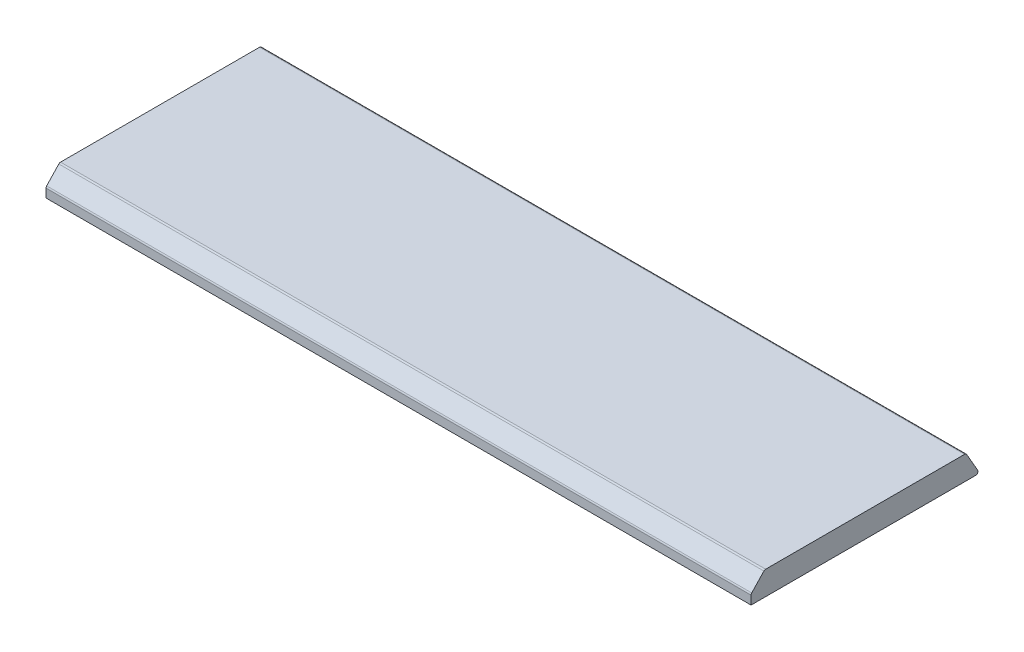
ISO-10303-21;
HEADER;
FILE_DESCRIPTION(('STEP AP214'),'2;1');
FILE_NAME('part.step','',(''),(''),'','','');
FILE_SCHEMA(('AUTOMOTIVE_DESIGN { 1 0 10303 214 1 1 1 1 }'));
ENDSEC;
DATA;
#1=APPLICATION_CONTEXT('core data for automotive mechanical design processes');
#2=APPLICATION_PROTOCOL_DEFINITION('international standard','automotive_design',2000,#1);
#3=PRODUCT_CONTEXT('',#1,'mechanical');
#4=PRODUCT('Part','Part','',(#3));
#5=PRODUCT_RELATED_PRODUCT_CATEGORY('part','',(#4));
#6=PRODUCT_DEFINITION_FORMATION('','',#4);
#7=PRODUCT_DEFINITION_CONTEXT('part definition',#1,'design');
#8=PRODUCT_DEFINITION('design','',#6,#7);
#9=PRODUCT_DEFINITION_SHAPE('','',#8);
#10=(LENGTH_UNIT() NAMED_UNIT(*) SI_UNIT(.MILLI.,.METRE.));
#11=(NAMED_UNIT(*) PLANE_ANGLE_UNIT() SI_UNIT($,.RADIAN.));
#12=(NAMED_UNIT(*) SI_UNIT($,.STERADIAN.) SOLID_ANGLE_UNIT());
#13=UNCERTAINTY_MEASURE_WITH_UNIT(LENGTH_MEASURE(1.E-05),#10,'distance_accuracy_value','');
#14=(GEOMETRIC_REPRESENTATION_CONTEXT(3) GLOBAL_UNCERTAINTY_ASSIGNED_CONTEXT((#13)) GLOBAL_UNIT_ASSIGNED_CONTEXT((#10,
#11,#12)) REPRESENTATION_CONTEXT('',''));
#15=CARTESIAN_POINT('',(0.,0.,0.));
#16=DIRECTION('',(0.,0.,1.));
#17=DIRECTION('',(1.,0.,0.));
#18=AXIS2_PLACEMENT_3D('',#15,#16,#17);
#19=CARTESIAN_POINT('',(-234.95,3.17499999999993,0.));
#20=DIRECTION('',(0.,0.,1.));
#21=DIRECTION('',(0.,-1.,0.));
#22=AXIS2_PLACEMENT_3D('',#19,#20,#21);
#23=PLANE('',#22);
#24=DIRECTION('',(0.,-1.,0.));
#25=VECTOR('',#24,1.);
#26=CARTESIAN_POINT('',(0.,3.17499999999993,0.));
#27=LINE('',#26,#25);
#28=CARTESIAN_POINT('',(0.,2.85900833816846,0.));
#29=VERTEX_POINT('',#28);
#30=CARTESIAN_POINT('',(0.,0.,0.));
#31=VERTEX_POINT('',#30);
#32=EDGE_CURVE('E146',#29,#31,#27,.T.);
#33=ORIENTED_EDGE('',*,*,#32,.F.);
#34=DIRECTION('',(1.,0.,0.));
#35=VECTOR('',#34,1.);
#36=CARTESIAN_POINT('',(-234.95,2.85900833816846,0.));
#37=LINE('',#36,#35);
#38=CARTESIAN_POINT('',(-234.95,2.85900833816846,0.));
#39=VERTEX_POINT('',#38);
#40=EDGE_CURVE('E11',#29,#39,#37,.F.);
#41=ORIENTED_EDGE('',*,*,#40,.T.);
#42=DIRECTION('',(0.,-1.,0.));
#43=VECTOR('',#42,1.);
#44=CARTESIAN_POINT('',(-234.95,3.17499999999993,0.));
#45=LINE('',#44,#43);
#46=CARTESIAN_POINT('',(-234.95,0.,0.));
#47=VERTEX_POINT('',#46);
#48=EDGE_CURVE('E116',#39,#47,#45,.T.);
#49=ORIENTED_EDGE('',*,*,#48,.T.);
#50=DIRECTION('',(1.,0.,0.));
#51=VECTOR('',#50,1.);
#52=CARTESIAN_POINT('',(-234.95,0.,0.));
#53=LINE('',#52,#51);
#54=EDGE_CURVE('E119',#47,#31,#53,.T.);
#55=ORIENTED_EDGE('',*,*,#54,.T.);
#56=EDGE_LOOP('',(#33,#41,#49,#55));
#57=FACE_BOUND('',#56,.T.);
#58=ADVANCED_FACE('F43',(#57),#23,.T.);
#59=CARTESIAN_POINT('',(-234.95,7.93749999999999,-4.50603104530065));
#60=DIRECTION('',(0.,0.687277405539241,0.7263950494292));
#61=DIRECTION('',(0.,-0.7263950494292,0.687277405539241));
#62=AXIS2_PLACEMENT_3D('',#59,#60,#61);
#63=PLANE('',#62);
#64=DIRECTION('',(0.,-0.7263950494292,0.687277405539241));
#65=VECTOR('',#64,1.);
#66=CARTESIAN_POINT('',(-234.95,7.93749999999999,-4.50603104530065));
#67=LINE('',#66,#65);
#68=CARTESIAN_POINT('',(-234.95,7.68927644064676,-4.27117475876612));
#69=VERTEX_POINT('',#68);
#70=CARTESIAN_POINT('',(-234.95,3.40453477881523,-0.217173929515574));
#71=VERTEX_POINT('',#70);
#72=EDGE_CURVE('E133',#69,#71,#67,.T.);
#73=ORIENTED_EDGE('',*,*,#72,.T.);
#74=DIRECTION('',(1.,0.,0.));
#75=VECTOR('',#74,1.);
#76=CARTESIAN_POINT('',(-234.95,3.40453477881523,-0.217173929515574));
#77=LINE('',#76,#75);
#78=CARTESIAN_POINT('',(0.,3.40453477881523,-0.217173929515574));
#79=VERTEX_POINT('',#78);
#80=EDGE_CURVE('E52',#71,#79,#77,.T.);
#81=ORIENTED_EDGE('',*,*,#80,.T.);
#82=DIRECTION('',(0.,-0.7263950494292,0.687277405539241));
#83=VECTOR('',#82,1.);
#84=CARTESIAN_POINT('',(0.,7.93749999999999,-4.50603104530065));
#85=LINE('',#84,#83);
#86=CARTESIAN_POINT('',(0.,7.68927644064676,-4.27117475876612));
#87=VERTEX_POINT('',#86);
#88=EDGE_CURVE('E123',#87,#79,#85,.T.);
#89=ORIENTED_EDGE('',*,*,#88,.F.);
#90=DIRECTION('',(1.,0.,0.));
#91=VECTOR('',#90,1.);
#92=CARTESIAN_POINT('',(-234.95,7.68927644064676,-4.27117475876612));
#93=LINE('',#92,#91);
#94=EDGE_CURVE('E189',#87,#69,#93,.F.);
#95=ORIENTED_EDGE('',*,*,#94,.T.);
#96=EDGE_LOOP('',(#73,#81,#89,#95));
#97=FACE_BOUND('',#96,.T.);
#98=ADVANCED_FACE('F196',(#97),#63,.T.);
#99=CARTESIAN_POINT('',(-234.95,7.9375,-71.6172822383074));
#100=DIRECTION('',(0.,1.,0.));
#101=DIRECTION('',(0.,0.,1.));
#102=AXIS2_PLACEMENT_3D('',#99,#100,#101);
#103=PLANE('',#102);
#104=DIRECTION('',(0.,0.,1.));
#105=VECTOR('',#104,1.);
#106=CARTESIAN_POINT('',(0.,7.9375,-71.6172822383074));
#107=LINE('',#106,#105);
#108=CARTESIAN_POINT('',(0.,7.9375,-71.1590104621381));
#109=VERTEX_POINT('',#108);
#110=CARTESIAN_POINT('',(0.,7.93749999999999,-4.84775082925054));
#111=VERTEX_POINT('',#110);
#112=EDGE_CURVE('E153',#109,#111,#107,.T.);
#113=ORIENTED_EDGE('',*,*,#112,.F.);
#114=DIRECTION('',(1.,0.,0.));
#115=VECTOR('',#114,1.);
#116=CARTESIAN_POINT('',(-234.95,7.9375,-71.1590104621381));
#117=LINE('',#116,#115);
#118=CARTESIAN_POINT('',(-234.95,7.9375,-71.1590104621381));
#119=VERTEX_POINT('',#118);
#120=EDGE_CURVE('E177',#109,#119,#117,.F.);
#121=ORIENTED_EDGE('',*,*,#120,.T.);
#122=DIRECTION('',(0.,0.,1.));
#123=VECTOR('',#122,1.);
#124=CARTESIAN_POINT('',(-234.95,7.9375,-71.6172822383074));
#125=LINE('',#124,#123);
#126=CARTESIAN_POINT('',(-234.95,7.93749999999999,-4.84775082925054));
#127=VERTEX_POINT('',#126);
#128=EDGE_CURVE('E140',#119,#127,#125,.T.);
#129=ORIENTED_EDGE('',*,*,#128,.T.);
#130=DIRECTION('',(1.,0.,0.));
#131=VECTOR('',#130,1.);
#132=CARTESIAN_POINT('',(-234.95,7.93749999999999,-4.84775082925054));
#133=LINE('',#132,#131);
#134=EDGE_CURVE('E173',#127,#111,#133,.T.);
#135=ORIENTED_EDGE('',*,*,#134,.T.);
#136=EDGE_LOOP('',(#113,#121,#129,#135));
#137=FACE_BOUND('',#136,.T.);
#138=ADVANCED_FACE('F206',(#137),#103,.T.);
#139=CARTESIAN_POINT('',(-234.95,0.,-76.2));
#140=DIRECTION('',(0.,0.5,-0.866025403784439));
#141=DIRECTION('',(0.,0.866025403784439,0.5));
#142=AXIS2_PLACEMENT_3D('',#139,#140,#141);
#143=PLANE('',#142);
#144=DIRECTION('',(0.,0.866025403784439,0.5));
#145=VECTOR('',#144,1.);
#146=CARTESIAN_POINT('',(-234.95,0.,-76.2));
#147=LINE('',#146,#145);
#148=CARTESIAN_POINT('',(-234.95,1.19062500000001,-75.5125923357461));
#149=VERTEX_POINT('',#148);
#150=CARTESIAN_POINT('',(-234.95,7.54062499999999,-71.846418126392));
#151=VERTEX_POINT('',#150);
#152=EDGE_CURVE('E137',#149,#151,#147,.T.);
#153=ORIENTED_EDGE('',*,*,#152,.T.);
#154=DIRECTION('',(1.,0.,0.));
#155=VECTOR('',#154,1.);
#156=CARTESIAN_POINT('',(-234.95,7.540625,-71.846418126392));
#157=LINE('',#156,#155);
#158=CARTESIAN_POINT('',(0.,7.54062499999999,-71.846418126392));
#159=VERTEX_POINT('',#158);
#160=EDGE_CURVE('E161',#151,#159,#157,.T.);
#161=ORIENTED_EDGE('',*,*,#160,.T.);
#162=DIRECTION('',(0.,0.866025403784439,0.5));
#163=VECTOR('',#162,1.);
#164=CARTESIAN_POINT('',(0.,0.,-76.2));
#165=LINE('',#164,#163);
#166=CARTESIAN_POINT('',(0.,1.19062500000001,-75.5125923357461));
#167=VERTEX_POINT('',#166);
#168=EDGE_CURVE('E150',#167,#159,#165,.T.);
#169=ORIENTED_EDGE('',*,*,#168,.F.);
#170=DIRECTION('',(1.,0.,0.));
#171=VECTOR('',#170,1.);
#172=CARTESIAN_POINT('',(-234.95,1.19062500000001,-75.5125923357461));
#173=LINE('',#172,#171);
#174=EDGE_CURVE('E132',#167,#149,#173,.F.);
#175=ORIENTED_EDGE('',*,*,#174,.T.);
#176=EDGE_LOOP('',(#153,#161,#169,#175));
#177=FACE_BOUND('',#176,.T.);
#178=ADVANCED_FACE('F214',(#177),#143,.T.);
#179=CARTESIAN_POINT('',(-234.95,0.,0.));
#180=DIRECTION('',(0.,-1.,0.));
#181=DIRECTION('',(0.,0.,-1.));
#182=AXIS2_PLACEMENT_3D('',#179,#180,#181);
#183=PLANE('',#182);
#184=DIRECTION('',(0.,0.,-1.));
#185=VECTOR('',#184,1.);
#186=CARTESIAN_POINT('',(-234.95,0.,0.));
#187=LINE('',#186,#185);
#188=CARTESIAN_POINT('',(-234.95,0.,-74.8251846714922));
#189=VERTEX_POINT('',#188);
#190=EDGE_CURVE('E122',#47,#189,#187,.T.);
#191=ORIENTED_EDGE('',*,*,#190,.T.);
#192=DIRECTION('',(1.,0.,0.));
#193=VECTOR('',#192,1.);
#194=CARTESIAN_POINT('',(-234.95,0.,-74.8251846714922));
#195=LINE('',#194,#193);
#196=CARTESIAN_POINT('',(0.,0.,-74.8251846714922));
#197=VERTEX_POINT('',#196);
#198=EDGE_CURVE('E186',#189,#197,#195,.T.);
#199=ORIENTED_EDGE('',*,*,#198,.T.);
#200=DIRECTION('',(0.,0.,-1.));
#201=VECTOR('',#200,1.);
#202=CARTESIAN_POINT('',(0.,0.,0.));
#203=LINE('',#202,#201);
#204=EDGE_CURVE('E130',#31,#197,#203,.T.);
#205=ORIENTED_EDGE('',*,*,#204,.F.);
#206=ORIENTED_EDGE('',*,*,#54,.F.);
#207=EDGE_LOOP('',(#191,#199,#205,#206));
#208=FACE_BOUND('',#207,.T.);
#209=ADVANCED_FACE('F126',(#208),#183,.T.);
#210=CARTESIAN_POINT('',(-234.95,0.,0.));
#211=DIRECTION('',(1.,0.,0.));
#212=DIRECTION('',(0.,0.,-1.));
#213=AXIS2_PLACEMENT_3D('',#210,#211,#212);
#214=PLANE('',#213);
#215=ORIENTED_EDGE('',*,*,#128,.F.);
#216=CARTESIAN_POINT('',(-234.95,7.14375,-71.1590104621381));
#217=DIRECTION('',(1.,0.,0.));
#218=DIRECTION('',(0.,0.,-1.));
#219=AXIS2_PLACEMENT_3D('',#216,#217,#218);
#220=CIRCLE('',#219,0.79375);
#221=EDGE_CURVE('E184',#119,#151,#220,.F.);
#222=ORIENTED_EDGE('',*,*,#221,.T.);
#223=ORIENTED_EDGE('',*,*,#152,.F.);
#224=CARTESIAN_POINT('',(-234.95,0.79375,-74.8251846714922));
#225=DIRECTION('',(1.,0.,0.));
#226=DIRECTION('',(0.,0.,-1.));
#227=AXIS2_PLACEMENT_3D('',#224,#225,#226);
#228=CIRCLE('',#227,0.79375);
#229=EDGE_CURVE('E59',#149,#189,#228,.F.);
#230=ORIENTED_EDGE('',*,*,#229,.T.);
#231=ORIENTED_EDGE('',*,*,#190,.F.);
#232=ORIENTED_EDGE('',*,*,#48,.F.);
#233=CARTESIAN_POINT('',(-234.95,2.85900833816846,-0.79375));
#234=DIRECTION('',(1.,0.,0.));
#235=DIRECTION('',(0.,0.,-1.));
#236=AXIS2_PLACEMENT_3D('',#233,#234,#235);
#237=CIRCLE('',#236,0.79375);
#238=EDGE_CURVE('E66',#39,#71,#237,.F.);
#239=ORIENTED_EDGE('',*,*,#238,.T.);
#240=ORIENTED_EDGE('',*,*,#72,.F.);
#241=CARTESIAN_POINT('',(-234.95,7.14374999999999,-4.84775082925054));
#242=DIRECTION('',(1.,0.,0.));
#243=DIRECTION('',(0.,0.,-1.));
#244=AXIS2_PLACEMENT_3D('',#241,#242,#243);
#245=CIRCLE('',#244,0.79375);
#246=EDGE_CURVE('E180',#69,#127,#245,.F.);
#247=ORIENTED_EDGE('',*,*,#246,.T.);
#248=EDGE_LOOP('',(#215,#222,#223,#230,#231,#232,#239,#240,#247));
#249=FACE_BOUND('',#248,.T.);
#250=ADVANCED_FACE('F136',(#249),#214,.F.);
#251=CARTESIAN_POINT('',(0.,0.,0.));
#252=DIRECTION('',(1.,0.,0.));
#253=DIRECTION('',(0.,0.,-1.));
#254=AXIS2_PLACEMENT_3D('',#251,#252,#253);
#255=PLANE('',#254);
#256=ORIENTED_EDGE('',*,*,#168,.T.);
#257=CARTESIAN_POINT('',(0.,7.14375,-71.1590104621381));
#258=DIRECTION('',(1.,0.,0.));
#259=DIRECTION('',(0.,0.,-1.));
#260=AXIS2_PLACEMENT_3D('',#257,#258,#259);
#261=CIRCLE('',#260,0.79375);
#262=EDGE_CURVE('E171',#159,#109,#261,.T.);
#263=ORIENTED_EDGE('',*,*,#262,.T.);
#264=ORIENTED_EDGE('',*,*,#112,.T.);
#265=CARTESIAN_POINT('',(0.,7.14374999999999,-4.84775082925054));
#266=DIRECTION('',(1.,0.,0.));
#267=DIRECTION('',(0.,0.,-1.));
#268=AXIS2_PLACEMENT_3D('',#265,#266,#267);
#269=CIRCLE('',#268,0.79375);
#270=EDGE_CURVE('E165',#111,#87,#269,.T.);
#271=ORIENTED_EDGE('',*,*,#270,.T.);
#272=ORIENTED_EDGE('',*,*,#88,.T.);
#273=CARTESIAN_POINT('',(0.,2.85900833816846,-0.79375));
#274=DIRECTION('',(1.,0.,0.));
#275=DIRECTION('',(0.,0.,-1.));
#276=AXIS2_PLACEMENT_3D('',#273,#274,#275);
#277=CIRCLE('',#276,0.79375);
#278=EDGE_CURVE('E167',#79,#29,#277,.T.);
#279=ORIENTED_EDGE('',*,*,#278,.T.);
#280=ORIENTED_EDGE('',*,*,#32,.T.);
#281=ORIENTED_EDGE('',*,*,#204,.T.);
#282=CARTESIAN_POINT('',(0.,0.79375,-74.8251846714922));
#283=DIRECTION('',(1.,0.,0.));
#284=DIRECTION('',(0.,0.,-1.));
#285=AXIS2_PLACEMENT_3D('',#282,#283,#284);
#286=CIRCLE('',#285,0.79375);
#287=EDGE_CURVE('E169',#197,#167,#286,.T.);
#288=ORIENTED_EDGE('',*,*,#287,.T.);
#289=EDGE_LOOP('',(#256,#263,#264,#271,#272,#279,#280,#281,#288));
#290=FACE_BOUND('',#289,.T.);
#291=ADVANCED_FACE('F200',(#290),#255,.T.);
#292=CARTESIAN_POINT('',(-234.95,7.14375,-71.1590104621381));
#293=DIRECTION('',(1.,0.,0.));
#294=DIRECTION('',(0.,0.,-1.));
#295=AXIS2_PLACEMENT_3D('',#292,#293,#294);
#296=CYLINDRICAL_SURFACE('',#295,0.79375);
#297=ORIENTED_EDGE('',*,*,#221,.F.);
#298=ORIENTED_EDGE('',*,*,#120,.F.);
#299=ORIENTED_EDGE('',*,*,#262,.F.);
#300=ORIENTED_EDGE('',*,*,#160,.F.);
#301=EDGE_LOOP('',(#297,#298,#299,#300));
#302=FACE_BOUND('',#301,.T.);
#303=ADVANCED_FACE('F211',(#302),#296,.T.);
#304=CARTESIAN_POINT('',(-234.95,0.79375,-74.8251846714922));
#305=DIRECTION('',(1.,0.,0.));
#306=DIRECTION('',(0.,0.,-1.));
#307=AXIS2_PLACEMENT_3D('',#304,#305,#306);
#308=CYLINDRICAL_SURFACE('',#307,0.79375);
#309=ORIENTED_EDGE('',*,*,#229,.F.);
#310=ORIENTED_EDGE('',*,*,#174,.F.);
#311=ORIENTED_EDGE('',*,*,#287,.F.);
#312=ORIENTED_EDGE('',*,*,#198,.F.);
#313=EDGE_LOOP('',(#309,#310,#311,#312));
#314=FACE_BOUND('',#313,.T.);
#315=ADVANCED_FACE('F217',(#314),#308,.T.);
#316=CARTESIAN_POINT('',(-234.95,2.85900833816846,-0.79375));
#317=DIRECTION('',(1.,0.,0.));
#318=DIRECTION('',(0.,0.,-1.));
#319=AXIS2_PLACEMENT_3D('',#316,#317,#318);
#320=CYLINDRICAL_SURFACE('',#319,0.79375);
#321=ORIENTED_EDGE('',*,*,#238,.F.);
#322=ORIENTED_EDGE('',*,*,#40,.F.);
#323=ORIENTED_EDGE('',*,*,#278,.F.);
#324=ORIENTED_EDGE('',*,*,#80,.F.);
#325=EDGE_LOOP('',(#321,#322,#323,#324));
#326=FACE_BOUND('',#325,.T.);
#327=ADVANCED_FACE('F219',(#326),#320,.T.);
#328=CARTESIAN_POINT('',(-234.95,7.14374999999999,-4.84775082925054));
#329=DIRECTION('',(1.,0.,0.));
#330=DIRECTION('',(0.,0.,-1.));
#331=AXIS2_PLACEMENT_3D('',#328,#329,#330);
#332=CYLINDRICAL_SURFACE('',#331,0.79375);
#333=ORIENTED_EDGE('',*,*,#246,.F.);
#334=ORIENTED_EDGE('',*,*,#94,.F.);
#335=ORIENTED_EDGE('',*,*,#270,.F.);
#336=ORIENTED_EDGE('',*,*,#134,.F.);
#337=EDGE_LOOP('',(#333,#334,#335,#336));
#338=FACE_BOUND('',#337,.T.);
#339=ADVANCED_FACE('F45',(#338),#332,.T.);
#340=CLOSED_SHELL('',(#58,#98,#138,#178,#209,#250,#291,#303,#315,#327,#339));
#341=MANIFOLD_SOLID_BREP('B2',#340);
#342=ADVANCED_BREP_SHAPE_REPRESENTATION('',(#18,#341),#14);
#343=SHAPE_DEFINITION_REPRESENTATION(#9,#342);
ENDSEC;
END-ISO-10303-21;
